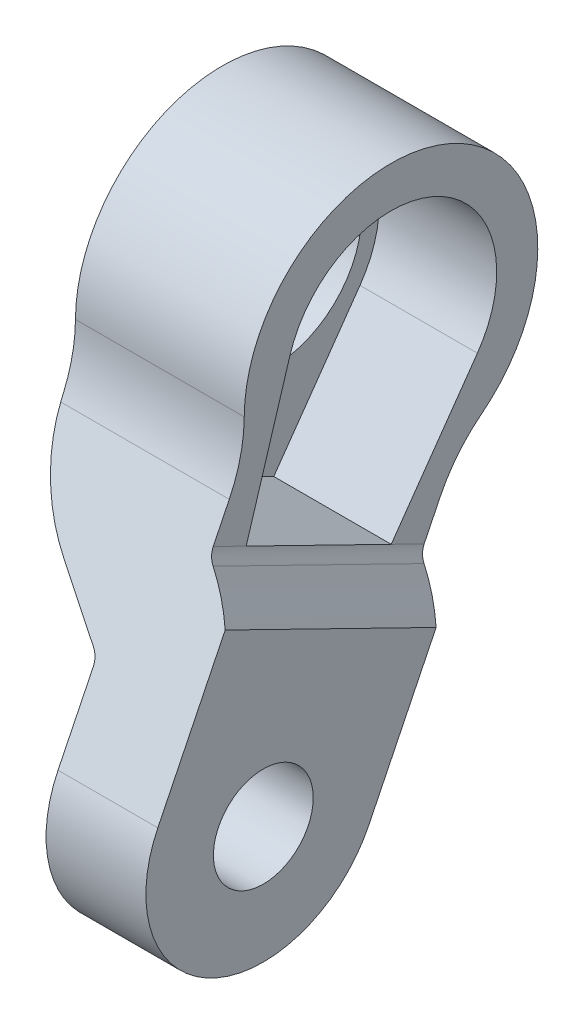
ISO-10303-21;
HEADER;
FILE_DESCRIPTION(('STEP AP214'),'2;1');
FILE_NAME('part.step','',(''),(''),'','','');
FILE_SCHEMA(('AUTOMOTIVE_DESIGN { 1 0 10303 214 1 1 1 1 }'));
ENDSEC;
DATA;
#1=APPLICATION_CONTEXT('core data for automotive mechanical design processes');
#2=APPLICATION_PROTOCOL_DEFINITION('international standard','automotive_design',2000,#1);
#3=PRODUCT_CONTEXT('',#1,'mechanical');
#4=PRODUCT('Part','Part','',(#3));
#5=PRODUCT_RELATED_PRODUCT_CATEGORY('part','',(#4));
#6=PRODUCT_DEFINITION_FORMATION('','',#4);
#7=PRODUCT_DEFINITION_CONTEXT('part definition',#1,'design');
#8=PRODUCT_DEFINITION('design','',#6,#7);
#9=PRODUCT_DEFINITION_SHAPE('','',#8);
#10=(LENGTH_UNIT() NAMED_UNIT(*) SI_UNIT(.MILLI.,.METRE.));
#11=(NAMED_UNIT(*) PLANE_ANGLE_UNIT() SI_UNIT($,.RADIAN.));
#12=(NAMED_UNIT(*) SI_UNIT($,.STERADIAN.) SOLID_ANGLE_UNIT());
#13=UNCERTAINTY_MEASURE_WITH_UNIT(LENGTH_MEASURE(1.E-05),#10,'distance_accuracy_value','');
#14=(GEOMETRIC_REPRESENTATION_CONTEXT(3) GLOBAL_UNCERTAINTY_ASSIGNED_CONTEXT((#13)) GLOBAL_UNIT_ASSIGNED_CONTEXT((#10,
#11,#12)) REPRESENTATION_CONTEXT('',''));
#15=CARTESIAN_POINT('',(0.,0.,0.));
#16=DIRECTION('',(0.,0.,1.));
#17=DIRECTION('',(1.,0.,0.));
#18=AXIS2_PLACEMENT_3D('',#15,#16,#17);
#19=CARTESIAN_POINT('',(-31.5963708891012,-42.7407828448025,-97.5));
#20=DIRECTION('',(1.,0.,0.));
#21=DIRECTION('',(0.,0.,-1.));
#22=AXIS2_PLACEMENT_3D('',#19,#20,#21);
#23=CYLINDRICAL_SURFACE('',#22,3.00000000000001);
#24=CARTESIAN_POINT('',(-37.3463708891012,-42.7407828448025,-97.5));
#25=DIRECTION('',(1.,0.,0.));
#26=DIRECTION('',(0.,0.,-1.));
#27=AXIS2_PLACEMENT_3D('',#24,#25,#26);
#28=CIRCLE('',#27,3.00000000000001);
#29=CARTESIAN_POINT('',(-37.3463708891012,-42.7407828448025,-100.5));
#30=VERTEX_POINT('',#29);
#31=EDGE_CURVE('E221',#30,#30,#28,.T.);
#32=ORIENTED_EDGE('',*,*,#31,.F.);
#33=EDGE_LOOP('',(#32));
#34=FACE_BOUND('',#33,.T.);
#35=CARTESIAN_POINT('',(-35.5963708891012,-42.7407828448025,-97.5));
#36=DIRECTION('',(1.,0.,0.));
#37=DIRECTION('',(0.,0.,-1.));
#38=AXIS2_PLACEMENT_3D('',#35,#36,#37);
#39=CIRCLE('',#38,3.00000000000001);
#40=CARTESIAN_POINT('',(-35.5963708891012,-42.7407828448025,-100.5));
#41=VERTEX_POINT('',#40);
#42=EDGE_CURVE('E215',#41,#41,#39,.F.);
#43=ORIENTED_EDGE('',*,*,#42,.F.);
#44=EDGE_LOOP('',(#43));
#45=FACE_BOUND('',#44,.T.);
#46=ADVANCED_FACE('F43',(#34,#45),#23,.F.);
#47=CARTESIAN_POINT('',(-37.3463708891012,-43.6775491989218,-92.5885370002625));
#48=DIRECTION('',(0.,0.439492943309416,0.898246042452304));
#49=DIRECTION('',(0.,-0.898246042452304,0.439492943309416));
#50=AXIS2_PLACEMENT_3D('',#47,#48,#49);
#51=PLANE('',#50);
#52=DIRECTION('',(0.,-0.898246042452304,0.439492943309416));
#53=VECTOR('',#52,1.);
#54=CARTESIAN_POINT('',(-31.5963708891012,-43.6775491989218,-92.5885370002625));
#55=LINE('',#54,#53);
#56=CARTESIAN_POINT('',(-31.5963708891012,-44.8981747970498,-91.9913105039058));
#57=VERTEX_POINT('',#56);
#58=CARTESIAN_POINT('',(-31.5963708891012,-46.0169963951081,-91.4438945689284));
#59=VERTEX_POINT('',#58);
#60=EDGE_CURVE('E244',#57,#59,#55,.T.);
#61=ORIENTED_EDGE('',*,*,#60,.F.);
#62=DIRECTION('',(-1.,0.,0.));
#63=VECTOR('',#62,1.);
#64=CARTESIAN_POINT('',(-37.3463708891012,-44.8981747970498,-91.9913105039058));
#65=LINE('',#64,#63);
#66=CARTESIAN_POINT('',(-37.3390460575148,-44.8981747970498,-91.9913105039058));
#67=VERTEX_POINT('',#66);
#68=EDGE_CURVE('E344',#57,#67,#65,.T.);
#69=ORIENTED_EDGE('',*,*,#68,.T.);
#70=CARTESIAN_POINT('',(-32.3463708891012,-44.6551587124589,-92.1102131756023));
#71=DIRECTION('',(0.,0.439492943309416,0.898246042452304));
#72=DIRECTION('',(0.,-0.898246042452304,0.439492943309416));
#73=AXIS2_PLACEMENT_3D('',#70,#71,#72);
#74=CIRCLE('',#73,5.);
#75=CARTESIAN_POINT('',(-35.745923554999,-47.9485557073489,-90.4988231216935));
#76=VERTEX_POINT('',#75);
#77=EDGE_CURVE('E324',#67,#76,#74,.T.);
#78=ORIENTED_EDGE('',*,*,#77,.T.);
#79=DIRECTION('',(-0.733295074899238,0.610726945650181,-0.298815881414161));
#80=VECTOR('',#79,1.);
#81=CARTESIAN_POINT('',(-38.9771579455963,-45.2574127042127,-91.8155429327665));
#82=LINE('',#81,#80);
#83=CARTESIAN_POINT('',(-34.0384245691934,-49.3706512265983,-89.8030216197846));
#84=VERTEX_POINT('',#83);
#85=EDGE_CURVE('E253',#84,#76,#82,.T.);
#86=ORIENTED_EDGE('',*,*,#85,.F.);
#87=CARTESIAN_POINT('',(-34.4463708891011,-49.7658588659851,-89.6096548133155));
#88=DIRECTION('',(0.,0.439492943309416,0.898246042452304));
#89=DIRECTION('',(0.,-0.898246042452304,0.439492943309416));
#90=AXIS2_PLACEMENT_3D('',#87,#88,#89);
#91=CIRCLE('',#90,0.6);
#92=CARTESIAN_POINT('',(-33.8463708891011,-49.7658588659851,-89.6096548133155));
#93=VERTEX_POINT('',#92);
#94=EDGE_CURVE('E319',#84,#93,#91,.F.);
#95=ORIENTED_EDGE('',*,*,#94,.T.);
#96=DIRECTION('',(0.,0.898246042452304,-0.439492943309416));
#97=VECTOR('',#96,1.);
#98=CARTESIAN_POINT('',(-33.8463708891011,-43.6775491989218,-92.5885370002625));
#99=LINE('',#98,#97);
#100=CARTESIAN_POINT('',(-33.8463708891011,-52.2238407825004,-88.4070158301908));
#101=VERTEX_POINT('',#100);
#102=EDGE_CURVE('E257',#101,#93,#99,.T.);
#103=ORIENTED_EDGE('',*,*,#102,.F.);
#104=DIRECTION('',(1.,0.,0.));
#105=VECTOR('',#104,1.);
#106=CARTESIAN_POINT('',(-37.3463708891012,-52.2238407825004,-88.4070158301908));
#107=LINE('',#106,#105);
#108=CARTESIAN_POINT('',(-30.4463708891012,-52.2238407825004,-88.4070158301908));
#109=VERTEX_POINT('',#108);
#110=EDGE_CURVE('E280',#101,#109,#107,.T.);
#111=ORIENTED_EDGE('',*,*,#110,.T.);
#112=DIRECTION('',(0.,-0.898246042452304,0.439492943309416));
#113=VECTOR('',#112,1.);
#114=CARTESIAN_POINT('',(-30.4463708891012,-43.6775491989218,-92.5885370002625));
#115=LINE('',#114,#113);
#116=CARTESIAN_POINT('',(-30.4463708891012,-47.5354188486235,-90.7009623190287));
#117=VERTEX_POINT('',#116);
#118=EDGE_CURVE('E270',#117,#109,#115,.T.);
#119=ORIENTED_EDGE('',*,*,#118,.F.);
#120=CARTESIAN_POINT('',(-34.8448971956873,-49.6710857245166,-89.6560253230892));
#121=DIRECTION('',(0.,0.439492943309416,0.898246042452304));
#122=DIRECTION('',(0.,-0.898246042452304,0.439492943309416));
#123=AXIS2_PLACEMENT_3D('',#120,#121,#122);
#124=CIRCLE('',#123,5.);
#125=CARTESIAN_POINT('',(-31.4087129933783,-46.4085059661161,-91.2523371497313));
#126=VERTEX_POINT('',#125);
#127=EDGE_CURVE('E237',#126,#117,#124,.F.);
#128=ORIENTED_EDGE('',*,*,#127,.F.);
#129=CARTESIAN_POINT('',(-30.9963708891012,-46.0169963951081,-91.4438945689284));
#130=DIRECTION('',(0.,0.439492943309416,0.898246042452304));
#131=DIRECTION('',(0.,-0.898246042452304,0.439492943309416));
#132=AXIS2_PLACEMENT_3D('',#129,#130,#131);
#133=CIRCLE('',#132,0.6);
#134=EDGE_CURVE('E311',#126,#59,#133,.F.);
#135=ORIENTED_EDGE('',*,*,#134,.T.);
#136=EDGE_LOOP('',(#61,#69,#78,#86,#95,#103,#111,#119,#128,#135));
#137=FACE_BOUND('',#136,.T.);
#138=ADVANCED_FACE('F387',(#137),#51,.T.);
#139=CARTESIAN_POINT('',(-37.3463708891012,-55.7397843289757,-95.5929841698093));
#140=DIRECTION('',(0.,-0.439492943309411,-0.898246042452307));
#141=DIRECTION('',(0.,0.898246042452306,-0.439492943309411));
#142=AXIS2_PLACEMENT_3D('',#139,#140,#141);
#143=PLANE('',#142);
#144=CARTESIAN_POINT('',(-32.3463708891012,-48.1711022589342,-99.2961815152208));
#145=DIRECTION('',(0.,-0.439492943309411,-0.898246042452307));
#146=DIRECTION('',(0.,0.898246042452306,-0.439492943309411));
#147=AXIS2_PLACEMENT_3D('',#144,#145,#146);
#148=CIRCLE('',#147,5.);
#149=CARTESIAN_POINT('',(-35.745923554999,-51.4644992538242,-97.6847914613119));
#150=VERTEX_POINT('',#149);
#151=CARTESIAN_POINT('',(-37.3390460575148,-48.4141183435251,-99.1772788435243));
#152=VERTEX_POINT('',#151);
#153=EDGE_CURVE('E330',#150,#152,#148,.T.);
#154=ORIENTED_EDGE('',*,*,#153,.T.);
#155=DIRECTION('',(-1.,0.,0.));
#156=VECTOR('',#155,1.);
#157=CARTESIAN_POINT('',(-31.5963708891012,-48.4141183435251,-99.1772788435243));
#158=LINE('',#157,#156);
#159=CARTESIAN_POINT('',(-31.5963708891012,-48.4141183435251,-99.1772788435243));
#160=VERTEX_POINT('',#159);
#161=EDGE_CURVE('E347',#152,#160,#158,.F.);
#162=ORIENTED_EDGE('',*,*,#161,.T.);
#163=DIRECTION('',(0.,0.898246042452306,-0.439492943309411));
#164=VECTOR('',#163,1.);
#165=CARTESIAN_POINT('',(-31.5963708891012,-55.7397843289757,-95.5929841698093));
#166=LINE('',#165,#164);
#167=CARTESIAN_POINT('',(-31.5963708891012,-49.5329399415834,-98.6298629085468));
#168=VERTEX_POINT('',#167);
#169=EDGE_CURVE('E289',#168,#160,#166,.T.);
#170=ORIENTED_EDGE('',*,*,#169,.F.);
#171=CARTESIAN_POINT('',(-30.9963708891012,-49.5329399415834,-98.6298629085468));
#172=DIRECTION('',(0.,-0.439492943309411,-0.898246042452307));
#173=DIRECTION('',(0.,0.898246042452306,-0.439492943309411));
#174=AXIS2_PLACEMENT_3D('',#171,#172,#173);
#175=CIRCLE('',#174,0.6);
#176=CARTESIAN_POINT('',(-31.4087129933783,-49.9244495125915,-98.4383054893498));
#177=VERTEX_POINT('',#176);
#178=EDGE_CURVE('E308',#168,#177,#175,.F.);
#179=ORIENTED_EDGE('',*,*,#178,.T.);
#180=CARTESIAN_POINT('',(-34.8448971956873,-53.1870292709919,-96.8419936627076));
#181=DIRECTION('',(0.,-0.439492943309411,-0.898246042452307));
#182=DIRECTION('',(0.,0.898246042452306,-0.439492943309411));
#183=AXIS2_PLACEMENT_3D('',#180,#181,#182);
#184=CIRCLE('',#183,5.);
#185=CARTESIAN_POINT('',(-30.4463708891012,-51.0513623950988,-97.8869306586472));
#186=VERTEX_POINT('',#185);
#187=EDGE_CURVE('E233',#186,#177,#184,.F.);
#188=ORIENTED_EDGE('',*,*,#187,.F.);
#189=DIRECTION('',(0.,0.898246042452306,-0.439492943309411));
#190=VECTOR('',#189,1.);
#191=CARTESIAN_POINT('',(-30.4463708891012,-55.7397843289757,-95.5929841698093));
#192=LINE('',#191,#190);
#193=CARTESIAN_POINT('',(-30.4463708891012,-55.7397843289757,-95.5929841698093));
#194=VERTEX_POINT('',#193);
#195=EDGE_CURVE('E274',#194,#186,#192,.T.);
#196=ORIENTED_EDGE('',*,*,#195,.F.);
#197=DIRECTION('',(1.,0.,0.));
#198=VECTOR('',#197,1.);
#199=CARTESIAN_POINT('',(-37.3463708891012,-55.7397843289757,-95.5929841698093));
#200=LINE('',#199,#198);
#201=CARTESIAN_POINT('',(-33.8463708891011,-55.7397843289756,-95.5929841698092));
#202=VERTEX_POINT('',#201);
#203=EDGE_CURVE('E269',#202,#194,#200,.T.);
#204=ORIENTED_EDGE('',*,*,#203,.F.);
#205=DIRECTION('',(0.,-0.898246042452304,0.439492943309416));
#206=VECTOR('',#205,1.);
#207=CARTESIAN_POINT('',(-33.8463708891011,-53.0465472416754,-96.9107285723297));
#208=LINE('',#207,#206);
#209=CARTESIAN_POINT('',(-33.8463708891011,-53.2818024124604,-96.7956231529339));
#210=VERTEX_POINT('',#209);
#211=EDGE_CURVE('E250',#210,#202,#208,.T.);
#212=ORIENTED_EDGE('',*,*,#211,.F.);
#213=CARTESIAN_POINT('',(-34.4463708891011,-53.2818024124605,-96.795623152934));
#214=DIRECTION('',(0.,-0.439492943309411,-0.898246042452307));
#215=DIRECTION('',(0.,0.898246042452306,-0.439492943309411));
#216=AXIS2_PLACEMENT_3D('',#213,#214,#215);
#217=CIRCLE('',#216,0.6);
#218=CARTESIAN_POINT('',(-34.0384245691934,-52.8865947730736,-96.988989959403));
#219=VERTEX_POINT('',#218);
#220=EDGE_CURVE('E315',#210,#219,#217,.F.);
#221=ORIENTED_EDGE('',*,*,#220,.T.);
#222=DIRECTION('',(0.733295074899238,-0.61072694565018,0.298815881414163));
#223=VECTOR('',#222,1.);
#224=CARTESIAN_POINT('',(-37.3463708891012,-50.1315620154765,-98.3369696869224));
#225=LINE('',#224,#223);
#226=EDGE_CURVE('E247',#150,#219,#225,.T.);
#227=ORIENTED_EDGE('',*,*,#226,.F.);
#228=EDGE_LOOP('',(#154,#162,#170,#179,#188,#196,#204,#212,#221,#227));
#229=FACE_BOUND('',#228,.T.);
#230=ADVANCED_FACE('F383',(#229),#143,.T.);
#231=CARTESIAN_POINT('',(-37.3463708891012,-53.981812555738,-92.));
#232=DIRECTION('',(1.,0.,0.));
#233=DIRECTION('',(0.,0.,-1.));
#234=AXIS2_PLACEMENT_3D('',#231,#232,#233);
#235=CYLINDRICAL_SURFACE('',#234,4.00000000000003);
#236=CARTESIAN_POINT('',(-33.8463708891011,-53.981812555738,-92.));
#237=DIRECTION('',(1.,0.,0.));
#238=DIRECTION('',(0.,0.,-1.));
#239=AXIS2_PLACEMENT_3D('',#236,#237,#238);
#240=CIRCLE('',#239,4.00000000000003);
#241=EDGE_CURVE('E261',#202,#101,#240,.F.);
#242=ORIENTED_EDGE('',*,*,#241,.F.);
#243=ORIENTED_EDGE('',*,*,#203,.T.);
#244=CARTESIAN_POINT('',(-30.4463708891012,-53.981812555738,-92.));
#245=DIRECTION('',(1.,0.,0.));
#246=DIRECTION('',(0.,0.,-1.));
#247=AXIS2_PLACEMENT_3D('',#244,#245,#246);
#248=CIRCLE('',#247,4.00000000000003);
#249=EDGE_CURVE('E264',#109,#194,#248,.T.);
#250=ORIENTED_EDGE('',*,*,#249,.F.);
#251=ORIENTED_EDGE('',*,*,#110,.F.);
#252=EDGE_LOOP('',(#242,#243,#250,#251));
#253=FACE_BOUND('',#252,.T.);
#254=ADVANCED_FACE('F379',(#253),#235,.T.);
#255=CARTESIAN_POINT('',(-37.3463708891012,-42.7407828448025,-97.5));
#256=DIRECTION('',(1.,0.,0.));
#257=DIRECTION('',(0.,0.,-1.));
#258=AXIS2_PLACEMENT_3D('',#255,#256,#257);
#259=CYLINDRICAL_SURFACE('',#258,5.);
#260=CARTESIAN_POINT('',(-37.3463708891012,-42.7407828448025,-97.5));
#261=DIRECTION('',(1.,0.,0.));
#262=DIRECTION('',(0.,0.,1.));
#263=AXIS2_PLACEMENT_3D('',#260,#261,#262);
#264=CIRCLE('',#263,5.);
#265=CARTESIAN_POINT('',(-37.3463708891012,-46.6761829524373,-100.584254527893));
#266=VERTEX_POINT('',#265);
#267=CARTESIAN_POINT('',(-37.3463708891012,-42.7207464626526,-92.5000401458221));
#268=VERTEX_POINT('',#267);
#269=EDGE_CURVE('E265',#266,#268,#264,.T.);
#270=ORIENTED_EDGE('',*,*,#269,.T.);
#271=DIRECTION('',(1.,0.,0.));
#272=VECTOR('',#271,1.);
#273=CARTESIAN_POINT('',(-37.3463708891012,-42.7207464626526,-92.5000401458221));
#274=LINE('',#273,#272);
#275=CARTESIAN_POINT('',(-31.5963708891012,-42.7207464626526,-92.5000401458221));
#276=VERTEX_POINT('',#275);
#277=EDGE_CURVE('E340',#268,#276,#274,.T.);
#278=ORIENTED_EDGE('',*,*,#277,.T.);
#279=CARTESIAN_POINT('',(-31.5963708891012,-42.7407828448025,-97.5));
#280=DIRECTION('',(-1.,0.,0.));
#281=DIRECTION('',(0.,0.,1.));
#282=AXIS2_PLACEMENT_3D('',#279,#280,#281);
#283=CIRCLE('',#282,5.);
#284=CARTESIAN_POINT('',(-31.5963708891012,-46.6761829524373,-100.584254527893));
#285=VERTEX_POINT('',#284);
#286=EDGE_CURVE('E240',#285,#276,#283,.F.);
#287=ORIENTED_EDGE('',*,*,#286,.F.);
#288=DIRECTION('',(1.,0.,0.));
#289=VECTOR('',#288,1.);
#290=CARTESIAN_POINT('',(-37.3463708891012,-46.6761829524373,-100.584254527893));
#291=LINE('',#290,#289);
#292=EDGE_CURVE('E334',#285,#266,#291,.F.);
#293=ORIENTED_EDGE('',*,*,#292,.T.);
#294=EDGE_LOOP('',(#270,#278,#287,#293));
#295=FACE_BOUND('',#294,.T.);
#296=ADVANCED_FACE('F382',(#295),#259,.T.);
#297=CARTESIAN_POINT('',(-37.3463708891012,-53.981812555738,-92.));
#298=DIRECTION('',(1.,0.,0.));
#299=DIRECTION('',(0.,0.,-1.));
#300=AXIS2_PLACEMENT_3D('',#297,#298,#299);
#301=PLANE('',#300);
#302=ORIENTED_EDGE('',*,*,#31,.T.);
#303=EDGE_LOOP('',(#302));
#304=FACE_BOUND('',#303,.T.);
#305=ORIENTED_EDGE('',*,*,#269,.F.);
#306=CARTESIAN_POINT('',(-37.3463708891012,-50.6115830600722,-103.668509055786));
#307=DIRECTION('',(1.,0.,0.));
#308=DIRECTION('',(0.,0.,-1.));
#309=AXIS2_PLACEMENT_3D('',#306,#307,#308);
#310=CIRCLE('',#309,5.);
#311=CARTESIAN_POINT('',(-37.3463708891012,-48.1743214707274,-99.3027610162049));
#312=VERTEX_POINT('',#311);
#313=EDGE_CURVE('E58',#266,#312,#310,.T.);
#314=ORIENTED_EDGE('',*,*,#313,.T.);
#315=DIRECTION('',(0.,0.439492943309417,0.898246042452304));
#316=VECTOR('',#315,1.);
#317=CARTESIAN_POINT('',(-37.3463708891012,-46.4131304856965,-95.7031973454115));
#318=LINE('',#317,#316);
#319=CARTESIAN_POINT('',(-37.3463708891012,-44.6519395006657,-92.1036336746182));
#320=VERTEX_POINT('',#319);
#321=EDGE_CURVE('E64',#312,#320,#318,.T.);
#322=ORIENTED_EDGE('',*,*,#321,.T.);
#323=CARTESIAN_POINT('',(-37.3463708891012,-42.7007100805027,-87.5000802916443));
#324=DIRECTION('',(1.,0.,0.));
#325=DIRECTION('',(0.,0.,-1.));
#326=AXIS2_PLACEMENT_3D('',#323,#324,#325);
#327=CIRCLE('',#326,5.);
#328=EDGE_CURVE('E361',#320,#268,#327,.T.);
#329=ORIENTED_EDGE('',*,*,#328,.T.);
#330=EDGE_LOOP('',(#305,#314,#322,#329));
#331=FACE_BOUND('',#330,.T.);
#332=ADVANCED_FACE('F391',(#304,#331),#301,.F.);
#333=CARTESIAN_POINT('',(-30.4463708891012,-53.981812555738,-92.));
#334=DIRECTION('',(1.,0.,0.));
#335=DIRECTION('',(0.,0.,-1.));
#336=AXIS2_PLACEMENT_3D('',#333,#334,#335);
#337=PLANE('',#336);
#338=CARTESIAN_POINT('',(-30.4463708891012,-53.981812555738,-92.));
#339=DIRECTION('',(1.,0.,0.));
#340=DIRECTION('',(0.,0.,-1.));
#341=AXIS2_PLACEMENT_3D('',#338,#339,#340);
#342=CIRCLE('',#341,1.70000000000001);
#343=CARTESIAN_POINT('',(-30.4463708891012,-53.981812555738,-93.7));
#344=VERTEX_POINT('',#343);
#345=EDGE_CURVE('E225',#344,#344,#342,.T.);
#346=ORIENTED_EDGE('',*,*,#345,.F.);
#347=EDGE_LOOP('',(#346));
#348=FACE_BOUND('',#347,.T.);
#349=DIRECTION('',(0.,-0.439492943309417,-0.898246042452304));
#350=VECTOR('',#349,1.);
#351=CARTESIAN_POINT('',(-30.4463708891012,-44.57727881414,-84.6550459523492));
#352=LINE('',#351,#350);
#353=EDGE_CURVE('E284',#117,#186,#352,.T.);
#354=ORIENTED_EDGE('',*,*,#353,.F.);
#355=ORIENTED_EDGE('',*,*,#118,.T.);
#356=ORIENTED_EDGE('',*,*,#249,.T.);
#357=ORIENTED_EDGE('',*,*,#195,.T.);
#358=EDGE_LOOP('',(#354,#355,#356,#357));
#359=FACE_BOUND('',#358,.T.);
#360=ADVANCED_FACE('F396',(#348,#359),#337,.T.);
#361=CARTESIAN_POINT('',(-33.8463708891011,-46.5724636607165,-83.6788438660318));
#362=DIRECTION('',(1.,0.,0.));
#363=DIRECTION('',(0.,0.,-1.));
#364=AXIS2_PLACEMENT_3D('',#361,#362,#363);
#365=PLANE('',#364);
#366=CARTESIAN_POINT('',(-33.8463708891011,-53.981812555738,-92.));
#367=DIRECTION('',(1.,0.,0.));
#368=DIRECTION('',(0.,0.,-1.));
#369=AXIS2_PLACEMENT_3D('',#366,#367,#368);
#370=CIRCLE('',#369,1.70000000000001);
#371=CARTESIAN_POINT('',(-33.8463708891011,-53.981812555738,-93.7));
#372=VERTEX_POINT('',#371);
#373=EDGE_CURVE('E229',#372,#372,#370,.T.);
#374=ORIENTED_EDGE('',*,*,#373,.T.);
#375=EDGE_LOOP('',(#374));
#376=FACE_BOUND('',#375,.T.);
#377=ORIENTED_EDGE('',*,*,#102,.T.);
#378=DIRECTION('',(0.,-0.439492943309417,-0.898246042452304));
#379=VECTOR('',#378,1.);
#380=CARTESIAN_POINT('',(-33.8463708891011,-53.2818024124604,-96.7956231529339));
#381=LINE('',#380,#379);
#382=EDGE_CURVE('E301',#93,#210,#381,.T.);
#383=ORIENTED_EDGE('',*,*,#382,.T.);
#384=ORIENTED_EDGE('',*,*,#211,.T.);
#385=ORIENTED_EDGE('',*,*,#241,.T.);
#386=EDGE_LOOP('',(#377,#383,#384,#385));
#387=FACE_BOUND('',#386,.T.);
#388=ADVANCED_FACE('F399',(#376,#387),#365,.F.);
#389=CARTESIAN_POINT('',(-37.3463708891012,-43.6574784345176,-85.1050849806245));
#390=DIRECTION('',(0.679910533179565,0.658679398978006,-0.322278010781765));
#391=DIRECTION('',(-0.695803973011685,0.718231739163033,0.));
#392=AXIS2_PLACEMENT_3D('',#389,#390,#391);
#393=PLANE('',#392);
#394=ORIENTED_EDGE('',*,*,#85,.T.);
#395=DIRECTION('',(0.,0.439492943309417,0.898246042452304));
#396=VECTOR('',#395,1.);
#397=CARTESIAN_POINT('',(-35.745923554999,-44.9904156728654,-84.452906755014));
#398=LINE('',#397,#396);
#399=EDGE_CURVE('E327',#76,#150,#398,.F.);
#400=ORIENTED_EDGE('',*,*,#399,.T.);
#401=ORIENTED_EDGE('',*,*,#226,.T.);
#402=DIRECTION('',(0.,-0.439492943309417,-0.898246042452304));
#403=VECTOR('',#402,1.);
#404=CARTESIAN_POINT('',(-34.0384245691934,-49.3706512265983,-89.8030216197846));
#405=LINE('',#404,#403);
#406=EDGE_CURVE('E305',#219,#84,#405,.F.);
#407=ORIENTED_EDGE('',*,*,#406,.T.);
#408=EDGE_LOOP('',(#394,#400,#401,#407));
#409=FACE_BOUND('',#408,.T.);
#410=ADVANCED_FACE('F404',(#409),#393,.F.);
#411=CARTESIAN_POINT('',(-31.5963708891012,-43.2987744180878,-85.2805913302292));
#412=DIRECTION('',(-1.,0.,0.));
#413=DIRECTION('',(0.,0.,1.));
#414=AXIS2_PLACEMENT_3D('',#411,#412,#413);
#415=PLANE('',#414);
#416=DIRECTION('',(0.,0.439492943309417,0.898246042452304));
#417=VECTOR('',#416,1.);
#418=CARTESIAN_POINT('',(-31.5963708891012,-49.5329399415834,-98.6298629085469));
#419=LINE('',#418,#417);
#420=CARTESIAN_POINT('',(-31.5963708891012,-46.5663625742448,-92.5667021219938));
#421=VERTEX_POINT('',#420);
#422=EDGE_CURVE('E294',#59,#421,#419,.F.);
#423=ORIENTED_EDGE('',*,*,#422,.T.);
#424=DIRECTION('',(0.,-0.956348026138291,0.29223013688084));
#425=VECTOR('',#424,1.);
#426=CARTESIAN_POINT('',(-31.5963708891012,-46.5663625742448,-92.5667021219938));
#427=LINE('',#426,#425);
#428=CARTESIAN_POINT('',(-31.5963708891012,-41.6887543520314,-94.0571471059022));
#429=VERTEX_POINT('',#428);
#430=EDGE_CURVE('E172',#429,#421,#427,.T.);
#431=ORIENTED_EDGE('',*,*,#430,.F.);
#432=CARTESIAN_POINT('',(-31.5963708891012,-42.7407828448025,-97.5));
#433=DIRECTION('',(1.,0.,0.));
#434=DIRECTION('',(0.,0.,-1.));
#435=AXIS2_PLACEMENT_3D('',#432,#433,#434);
#436=CIRCLE('',#435,3.6);
#437=CARTESIAN_POINT('',(-31.5963708891012,-44.8134508077852,-100.443475414408));
#438=VERTEX_POINT('',#437);
#439=EDGE_CURVE('E193',#438,#429,#436,.T.);
#440=ORIENTED_EDGE('',*,*,#439,.F.);
#441=DIRECTION('',(0.,0.817632059557811,-0.575741100828535));
#442=VECTOR('',#441,1.);
#443=CARTESIAN_POINT('',(-31.5963708891012,-48.9835737624466,-97.5070553554814));
#444=LINE('',#443,#442);
#445=CARTESIAN_POINT('',(-31.5963708891012,-48.9835737624466,-97.5070553554814));
#446=VERTEX_POINT('',#445);
#447=EDGE_CURVE('E197',#446,#438,#444,.T.);
#448=ORIENTED_EDGE('',*,*,#447,.F.);
#449=EDGE_CURVE('E293',#446,#168,#419,.F.);
#450=ORIENTED_EDGE('',*,*,#449,.T.);
#451=ORIENTED_EDGE('',*,*,#169,.T.);
#452=CARTESIAN_POINT('',(-31.5963708891012,-50.6115830600722,-103.668509055786));
#453=DIRECTION('',(-1.,0.,0.));
#454=DIRECTION('',(0.,0.,1.));
#455=AXIS2_PLACEMENT_3D('',#452,#453,#454);
#456=CIRCLE('',#455,5.);
#457=EDGE_CURVE('E624',#160,#285,#456,.T.);
#458=ORIENTED_EDGE('',*,*,#457,.T.);
#459=ORIENTED_EDGE('',*,*,#286,.T.);
#460=CARTESIAN_POINT('',(-31.5963708891012,-42.7007100805027,-87.5000802916443));
#461=DIRECTION('',(-1.,0.,0.));
#462=DIRECTION('',(0.,0.,1.));
#463=AXIS2_PLACEMENT_3D('',#460,#461,#462);
#464=CIRCLE('',#463,5.);
#465=EDGE_CURVE('E351',#276,#57,#464,.T.);
#466=ORIENTED_EDGE('',*,*,#465,.T.);
#467=ORIENTED_EDGE('',*,*,#60,.T.);
#468=EDGE_LOOP('',(#423,#431,#440,#448,#450,#451,#458,#459,#466,#467));
#469=FACE_BOUND('',#468,.T.);
#470=ADVANCED_FACE('F407',(#469),#415,.F.);
#471=CARTESIAN_POINT('',(-34.8448971956873,-46.7129456900331,-83.6101089564097));
#472=DIRECTION('',(0.,-0.439492943309417,-0.898246042452304));
#473=DIRECTION('',(0.,0.898246042452304,-0.439492943309417));
#474=AXIS2_PLACEMENT_3D('',#471,#472,#473);
#475=CYLINDRICAL_SURFACE('',#474,5.);
#476=ORIENTED_EDGE('',*,*,#187,.T.);
#477=DIRECTION('',(0.,-0.439492943309417,-0.898246042452304));
#478=VECTOR('',#477,1.);
#479=CARTESIAN_POINT('',(-31.4087129933783,-43.4503659316326,-85.2064207830519));
#480=LINE('',#479,#478);
#481=EDGE_CURVE('E298',#177,#126,#480,.F.);
#482=ORIENTED_EDGE('',*,*,#481,.T.);
#483=ORIENTED_EDGE('',*,*,#127,.T.);
#484=ORIENTED_EDGE('',*,*,#353,.T.);
#485=EDGE_LOOP('',(#476,#482,#483,#484));
#486=FACE_BOUND('',#485,.T.);
#487=ADVANCED_FACE('F412',(#486),#475,.T.);
#488=CARTESIAN_POINT('',(-30.4463708891012,-53.981812555738,-92.));
#489=DIRECTION('',(1.,0.,0.));
#490=DIRECTION('',(0.,0.,-1.));
#491=AXIS2_PLACEMENT_3D('',#488,#489,#490);
#492=CYLINDRICAL_SURFACE('',#491,1.70000000000001);
#493=ORIENTED_EDGE('',*,*,#373,.F.);
#494=EDGE_LOOP('',(#493));
#495=FACE_BOUND('',#494,.T.);
#496=ORIENTED_EDGE('',*,*,#345,.T.);
#497=EDGE_LOOP('',(#496));
#498=FACE_BOUND('',#497,.T.);
#499=ADVANCED_FACE('F377',(#495,#498),#492,.F.);
#500=CARTESIAN_POINT('',(-30.9963708891012,-43.0588563606246,-85.3979782022489));
#501=DIRECTION('',(0.,-0.439492943309417,-0.898246042452304));
#502=DIRECTION('',(0.,0.898246042452304,-0.439492943309417));
#503=AXIS2_PLACEMENT_3D('',#500,#501,#502);
#504=CYLINDRICAL_SURFACE('',#503,0.6);
#505=ORIENTED_EDGE('',*,*,#134,.F.);
#506=ORIENTED_EDGE('',*,*,#481,.F.);
#507=ORIENTED_EDGE('',*,*,#178,.F.);
#508=ORIENTED_EDGE('',*,*,#449,.F.);
#509=DIRECTION('',(0.,-0.439492943309418,-0.898246042452303));
#510=VECTOR('',#509,1.);
#511=CARTESIAN_POINT('',(-31.5963708891012,-46.5663625742448,-92.5667021219938));
#512=LINE('',#511,#510);
#513=EDGE_CURVE('E206',#421,#446,#512,.T.);
#514=ORIENTED_EDGE('',*,*,#513,.F.);
#515=ORIENTED_EDGE('',*,*,#422,.F.);
#516=EDGE_LOOP('',(#505,#506,#507,#508,#514,#515));
#517=FACE_BOUND('',#516,.T.);
#518=ADVANCED_FACE('F373',(#517),#504,.F.);
#519=CARTESIAN_POINT('',(-34.4463708891011,-46.8077188315016,-83.563738446636));
#520=DIRECTION('',(0.,0.439492943309417,0.898246042452304));
#521=DIRECTION('',(0.,-0.898246042452304,0.439492943309417));
#522=AXIS2_PLACEMENT_3D('',#519,#520,#521);
#523=CYLINDRICAL_SURFACE('',#522,0.6);
#524=ORIENTED_EDGE('',*,*,#94,.F.);
#525=ORIENTED_EDGE('',*,*,#406,.F.);
#526=ORIENTED_EDGE('',*,*,#220,.F.);
#527=ORIENTED_EDGE('',*,*,#382,.F.);
#528=EDGE_LOOP('',(#524,#525,#526,#527));
#529=FACE_BOUND('',#528,.T.);
#530=ADVANCED_FACE('F369',(#529),#523,.F.);
#531=CARTESIAN_POINT('',(-32.3463708891012,-46.4131304856965,-95.7031973454115));
#532=DIRECTION('',(0.,0.439492943309417,0.898246042452304));
#533=DIRECTION('',(0.,-0.898246042452304,0.439492943309417));
#534=AXIS2_PLACEMENT_3D('',#531,#532,#533);
#535=CYLINDRICAL_SURFACE('',#534,5.);
#536=ORIENTED_EDGE('',*,*,#153,.F.);
#537=ORIENTED_EDGE('',*,*,#399,.F.);
#538=ORIENTED_EDGE('',*,*,#77,.F.);
#539=CARTESIAN_POINT('',(-37.3390460575148,-44.8981747970498,-91.9913105039058));
#540=CARTESIAN_POINT('',(-37.3414883391177,-44.857672411217,-92.0111282186449));
#541=CARTESIAN_POINT('',(-37.3433198825513,-44.8169016102685,-92.0303973402404));
#542=CARTESIAN_POINT('',(-37.3457614930802,-44.7348231781405,-92.0678383971446));
#543=CARTESIAN_POINT('',(-37.3463715601753,-44.6935155469609,-92.0860103324531));
#544=CARTESIAN_POINT('',(-37.3463708891012,-44.6519395006657,-92.1036336746182));
#545=B_SPLINE_CURVE_WITH_KNOTS('',3,(#539,#540,#541,#542,#543,#544),.UNSPECIFIED.,.F.,.F.,(4,2,
4),(0.,0.13539647807645,0.270792956152906),.UNSPECIFIED.);
#546=EDGE_CURVE('E354',#67,#320,#545,.T.);
#547=ORIENTED_EDGE('',*,*,#546,.T.);
#548=ORIENTED_EDGE('',*,*,#321,.F.);
#549=CARTESIAN_POINT('',(-37.3463708891012,-48.1743214707274,-99.3027610162049));
#550=CARTESIAN_POINT('',(-37.3463715601753,-48.2137507859625,-99.2807501344711));
#551=CARTESIAN_POINT('',(-37.3457614930802,-48.2534485163131,-99.2592878458808));
#552=CARTESIAN_POINT('',(-37.3433198825513,-48.3333808072457,-99.2174604549873));
#553=CARTESIAN_POINT('',(-37.3414883391177,-48.3736153678276,-99.197095352684));
#554=CARTESIAN_POINT('',(-37.3390460575148,-48.4141183435251,-99.1772788435243));
#555=B_SPLINE_CURVE_WITH_KNOTS('',3,(#549,#550,#551,#552,#553,#554),.UNSPECIFIED.,.F.,.F.,(4,2,
4),(0.,0.135396478076436,0.270792956152879),.UNSPECIFIED.);
#556=EDGE_CURVE('E11',#312,#152,#555,.T.);
#557=ORIENTED_EDGE('',*,*,#556,.T.);
#558=EDGE_LOOP('',(#536,#537,#538,#547,#548,#557));
#559=FACE_BOUND('',#558,.T.);
#560=ADVANCED_FACE('F365',(#559),#535,.T.);
#561=CARTESIAN_POINT('',(-35.5963708891012,-42.7407828448025,-97.5));
#562=DIRECTION('',(1.,0.,0.));
#563=DIRECTION('',(0.,0.,-1.));
#564=AXIS2_PLACEMENT_3D('',#561,#562,#563);
#565=PLANE('',#564);
#566=DIRECTION('',(0.,-0.956348026138291,0.29223013688084));
#567=VECTOR('',#566,1.);
#568=CARTESIAN_POINT('',(-35.5963708891012,-46.5663625742448,-92.5667021219938));
#569=LINE('',#568,#567);
#570=CARTESIAN_POINT('',(-35.5963708891012,-41.6887543520314,-94.0571471059022));
#571=VERTEX_POINT('',#570);
#572=CARTESIAN_POINT('',(-35.5963708891012,-46.5663625742448,-92.5667021219938));
#573=VERTEX_POINT('',#572);
#574=EDGE_CURVE('E169',#571,#573,#569,.T.);
#575=ORIENTED_EDGE('',*,*,#574,.T.);
#576=DIRECTION('',(0.,-0.439492943309418,-0.898246042452303));
#577=VECTOR('',#576,1.);
#578=CARTESIAN_POINT('',(-35.5963708891012,-46.5663625742448,-92.5667021219938));
#579=LINE('',#578,#577);
#580=CARTESIAN_POINT('',(-35.5963708891012,-48.9835737624466,-97.5070553554814));
#581=VERTEX_POINT('',#580);
#582=EDGE_CURVE('E181',#573,#581,#579,.T.);
#583=ORIENTED_EDGE('',*,*,#582,.T.);
#584=DIRECTION('',(0.,0.817632059557811,-0.575741100828535));
#585=VECTOR('',#584,1.);
#586=CARTESIAN_POINT('',(-35.5963708891012,-48.9835737624466,-97.5070553554814));
#587=LINE('',#586,#585);
#588=CARTESIAN_POINT('',(-35.5963708891012,-44.8134508077852,-100.443475414408));
#589=VERTEX_POINT('',#588);
#590=EDGE_CURVE('E187',#581,#589,#587,.T.);
#591=ORIENTED_EDGE('',*,*,#590,.T.);
#592=CARTESIAN_POINT('',(-35.5963708891012,-42.7407828448025,-97.5));
#593=DIRECTION('',(1.,0.,0.));
#594=DIRECTION('',(0.,0.,-1.));
#595=AXIS2_PLACEMENT_3D('',#592,#593,#594);
#596=CIRCLE('',#595,3.6);
#597=EDGE_CURVE('E178',#589,#571,#596,.T.);
#598=ORIENTED_EDGE('',*,*,#597,.T.);
#599=EDGE_LOOP('',(#575,#583,#591,#598));
#600=FACE_BOUND('',#599,.T.);
#601=ORIENTED_EDGE('',*,*,#42,.T.);
#602=EDGE_LOOP('',(#601));
#603=FACE_BOUND('',#602,.T.);
#604=ADVANCED_FACE('F189',(#600,#603),#565,.T.);
#605=CARTESIAN_POINT('',(-35.5963708891012,-46.5663625742448,-92.5667021219938));
#606=DIRECTION('',(0.,0.29223013688084,0.956348026138291));
#607=DIRECTION('',(0.,-0.956348026138291,0.29223013688084));
#608=AXIS2_PLACEMENT_3D('',#605,#606,#607);
#609=PLANE('',#608);
#610=ORIENTED_EDGE('',*,*,#430,.T.);
#611=DIRECTION('',(1.,0.,0.));
#612=VECTOR('',#611,1.);
#613=CARTESIAN_POINT('',(-35.5963708891012,-46.5663625742448,-92.5667021219938));
#614=LINE('',#613,#612);
#615=EDGE_CURVE('E165',#573,#421,#614,.T.);
#616=ORIENTED_EDGE('',*,*,#615,.F.);
#617=ORIENTED_EDGE('',*,*,#574,.F.);
#618=DIRECTION('',(1.,0.,0.));
#619=VECTOR('',#618,1.);
#620=CARTESIAN_POINT('',(-35.5963708891012,-41.6887543520314,-94.0571471059022));
#621=LINE('',#620,#619);
#622=EDGE_CURVE('E212',#571,#429,#621,.T.);
#623=ORIENTED_EDGE('',*,*,#622,.T.);
#624=EDGE_LOOP('',(#610,#616,#617,#623));
#625=FACE_BOUND('',#624,.T.);
#626=ADVANCED_FACE('F167',(#625),#609,.F.);
#627=CARTESIAN_POINT('',(-35.5963708891012,-42.7407828448025,-97.5));
#628=DIRECTION('',(1.,0.,0.));
#629=DIRECTION('',(0.,0.,-1.));
#630=AXIS2_PLACEMENT_3D('',#627,#628,#629);
#631=CYLINDRICAL_SURFACE('',#630,3.6);
#632=ORIENTED_EDGE('',*,*,#439,.T.);
#633=ORIENTED_EDGE('',*,*,#622,.F.);
#634=ORIENTED_EDGE('',*,*,#597,.F.);
#635=DIRECTION('',(1.,0.,0.));
#636=VECTOR('',#635,1.);
#637=CARTESIAN_POINT('',(-35.5963708891012,-44.8134508077852,-100.443475414408));
#638=LINE('',#637,#636);
#639=EDGE_CURVE('E216',#589,#438,#638,.T.);
#640=ORIENTED_EDGE('',*,*,#639,.T.);
#641=EDGE_LOOP('',(#632,#633,#634,#640));
#642=FACE_BOUND('',#641,.T.);
#643=ADVANCED_FACE('F427',(#642),#631,.F.);
#644=CARTESIAN_POINT('',(-35.5963708891012,-48.9835737624466,-97.5070553554814));
#645=DIRECTION('',(0.,-0.575741100828535,-0.817632059557811));
#646=DIRECTION('',(0.,0.817632059557811,-0.575741100828535));
#647=AXIS2_PLACEMENT_3D('',#644,#645,#646);
#648=PLANE('',#647);
#649=ORIENTED_EDGE('',*,*,#447,.T.);
#650=ORIENTED_EDGE('',*,*,#639,.F.);
#651=ORIENTED_EDGE('',*,*,#590,.F.);
#652=DIRECTION('',(1.,0.,0.));
#653=VECTOR('',#652,1.);
#654=CARTESIAN_POINT('',(-35.5963708891012,-48.9835737624466,-97.5070553554814));
#655=LINE('',#654,#653);
#656=EDGE_CURVE('E177',#581,#446,#655,.T.);
#657=ORIENTED_EDGE('',*,*,#656,.T.);
#658=EDGE_LOOP('',(#649,#650,#651,#657));
#659=FACE_BOUND('',#658,.T.);
#660=ADVANCED_FACE('F430',(#659),#648,.F.);
#661=CARTESIAN_POINT('',(-35.5963708891012,-46.5663625742448,-92.5667021219938));
#662=DIRECTION('',(0.,-0.898246042452303,0.439492943309418));
#663=DIRECTION('',(0.,-0.439492943309418,-0.898246042452303));
#664=AXIS2_PLACEMENT_3D('',#661,#662,#663);
#665=PLANE('',#664);
#666=ORIENTED_EDGE('',*,*,#513,.T.);
#667=ORIENTED_EDGE('',*,*,#656,.F.);
#668=ORIENTED_EDGE('',*,*,#582,.F.);
#669=ORIENTED_EDGE('',*,*,#615,.T.);
#670=EDGE_LOOP('',(#666,#667,#668,#669));
#671=FACE_BOUND('',#670,.T.);
#672=ADVANCED_FACE('F182',(#671),#665,.F.);
#673=CARTESIAN_POINT('',(-37.3463708891012,-42.7007100805027,-87.5000802916443));
#674=DIRECTION('',(1.,0.,0.));
#675=DIRECTION('',(0.,0.,-1.));
#676=AXIS2_PLACEMENT_3D('',#673,#674,#675);
#677=CYLINDRICAL_SURFACE('',#676,5.);
#678=ORIENTED_EDGE('',*,*,#546,.F.);
#679=ORIENTED_EDGE('',*,*,#68,.F.);
#680=ORIENTED_EDGE('',*,*,#465,.F.);
#681=ORIENTED_EDGE('',*,*,#277,.F.);
#682=ORIENTED_EDGE('',*,*,#328,.F.);
#683=EDGE_LOOP('',(#678,#679,#680,#681,#682));
#684=FACE_BOUND('',#683,.T.);
#685=ADVANCED_FACE('F363',(#684),#677,.F.);
#686=CARTESIAN_POINT('',(-37.3463708891012,-50.6115830600722,-103.668509055786));
#687=DIRECTION('',(1.,0.,0.));
#688=DIRECTION('',(0.,0.,-1.));
#689=AXIS2_PLACEMENT_3D('',#686,#687,#688);
#690=CYLINDRICAL_SURFACE('',#689,5.);
#691=ORIENTED_EDGE('',*,*,#313,.F.);
#692=ORIENTED_EDGE('',*,*,#292,.F.);
#693=ORIENTED_EDGE('',*,*,#457,.F.);
#694=ORIENTED_EDGE('',*,*,#161,.F.);
#695=ORIENTED_EDGE('',*,*,#556,.F.);
#696=EDGE_LOOP('',(#691,#692,#693,#694,#695));
#697=FACE_BOUND('',#696,.T.);
#698=ADVANCED_FACE('F45',(#697),#690,.F.);
#699=CLOSED_SHELL('',(#46,#138,#230,#254,#296,#332,#360,#388,#410,#470,#487,#499,#518,#530,#560,
#604,#626,#643,#660,#672,#685,#698));
#700=MANIFOLD_SOLID_BREP('B2',#699);
#701=ADVANCED_BREP_SHAPE_REPRESENTATION('',(#18,#700),#14);
#702=SHAPE_DEFINITION_REPRESENTATION(#9,#701);
ENDSEC;
END-ISO-10303-21;
